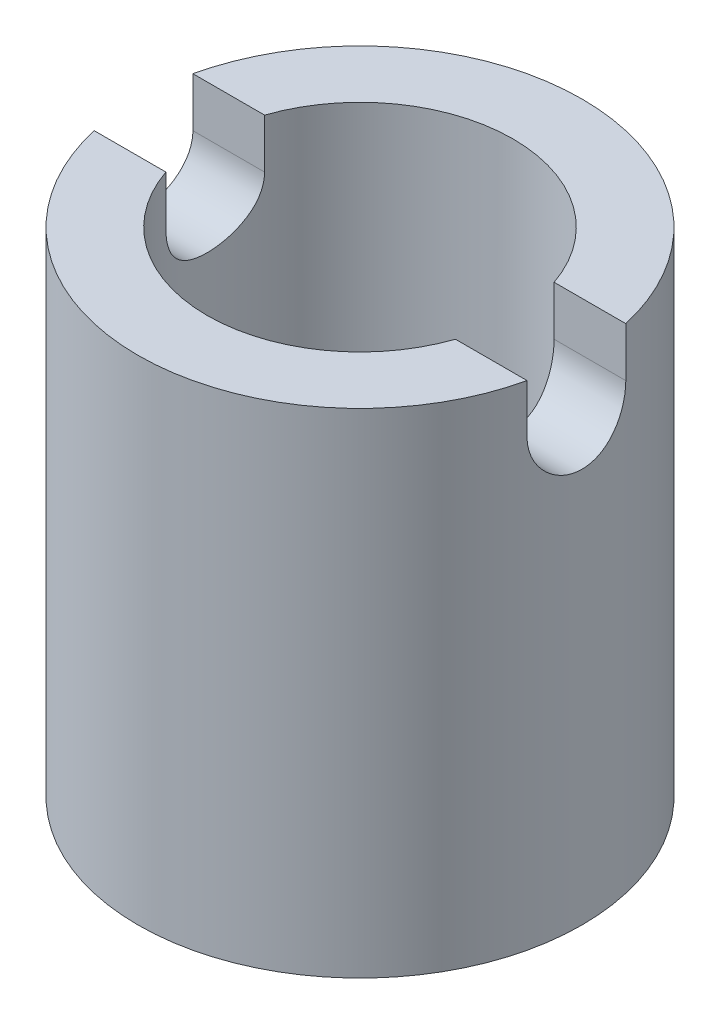
ISO-10303-21;
HEADER;
FILE_DESCRIPTION(('STEP AP214'),'2;1');
FILE_NAME('part.step','',(''),(''),'','','');
FILE_SCHEMA(('AUTOMOTIVE_DESIGN { 1 0 10303 214 1 1 1 1 }'));
ENDSEC;
DATA;
#1=APPLICATION_CONTEXT('core data for automotive mechanical design processes');
#2=APPLICATION_PROTOCOL_DEFINITION('international standard','automotive_design',2000,#1);
#3=PRODUCT_CONTEXT('',#1,'mechanical');
#4=PRODUCT('Part','Part','',(#3));
#5=PRODUCT_RELATED_PRODUCT_CATEGORY('part','',(#4));
#6=PRODUCT_DEFINITION_FORMATION('','',#4);
#7=PRODUCT_DEFINITION_CONTEXT('part definition',#1,'design');
#8=PRODUCT_DEFINITION('design','',#6,#7);
#9=PRODUCT_DEFINITION_SHAPE('','',#8);
#10=(LENGTH_UNIT() NAMED_UNIT(*) SI_UNIT(.MILLI.,.METRE.));
#11=(NAMED_UNIT(*) PLANE_ANGLE_UNIT() SI_UNIT($,.RADIAN.));
#12=(NAMED_UNIT(*) SI_UNIT($,.STERADIAN.) SOLID_ANGLE_UNIT());
#13=UNCERTAINTY_MEASURE_WITH_UNIT(LENGTH_MEASURE(1.E-05),#10,'distance_accuracy_value','');
#14=(GEOMETRIC_REPRESENTATION_CONTEXT(3) GLOBAL_UNCERTAINTY_ASSIGNED_CONTEXT((#13)) GLOBAL_UNIT_ASSIGNED_CONTEXT((#10,
#11,#12)) REPRESENTATION_CONTEXT('',''));
#15=CARTESIAN_POINT('',(0.,0.,0.));
#16=DIRECTION('',(0.,0.,1.));
#17=DIRECTION('',(1.,0.,0.));
#18=AXIS2_PLACEMENT_3D('',#15,#16,#17);
#19=CARTESIAN_POINT('',(0.,0.,0.));
#20=DIRECTION('',(0.,1.,0.));
#21=DIRECTION('',(0.,0.,1.));
#22=AXIS2_PLACEMENT_3D('',#19,#20,#21);
#23=PLANE('',#22);
#24=CARTESIAN_POINT('',(0.,0.,0.));
#25=DIRECTION('',(0.,1.,0.));
#26=DIRECTION('',(0.,0.,1.));
#27=AXIS2_PLACEMENT_3D('',#24,#25,#26);
#28=CIRCLE('',#27,4.5);
#29=CARTESIAN_POINT('',(0.,0.,4.5));
#30=VERTEX_POINT('',#29);
#31=EDGE_CURVE('E217',#30,#30,#28,.T.);
#32=ORIENTED_EDGE('',*,*,#31,.F.);
#33=EDGE_LOOP('',(#32));
#34=FACE_BOUND('',#33,.T.);
#35=CARTESIAN_POINT('',(0.,0.,0.));
#36=DIRECTION('',(0.,1.,0.));
#37=DIRECTION('',(0.,0.,1.));
#38=AXIS2_PLACEMENT_3D('',#35,#36,#37);
#39=CIRCLE('',#38,3.1);
#40=CARTESIAN_POINT('',(0.,0.,3.1));
#41=VERTEX_POINT('',#40);
#42=EDGE_CURVE('E50',#41,#41,#39,.T.);
#43=ORIENTED_EDGE('',*,*,#42,.T.);
#44=EDGE_LOOP('',(#43));
#45=FACE_BOUND('',#44,.T.);
#46=ADVANCED_FACE('F45',(#34,#45),#23,.F.);
#47=CARTESIAN_POINT('',(0.,9.,0.));
#48=DIRECTION('',(0.,-1.,0.));
#49=DIRECTION('',(0.,0.,-1.));
#50=AXIS2_PLACEMENT_3D('',#47,#48,#49);
#51=CYLINDRICAL_SURFACE('',#50,4.5);
#52=CARTESIAN_POINT('',(-4.38748219369606,9.,0.999999999999999));
#53=CARTESIAN_POINT('',(-4.38748057820017,8.9722374267632,1.00000022729756));
#54=CARTESIAN_POINT('',(-4.38774603792456,8.94448850762744,0.998843124720514));
#55=CARTESIAN_POINT('',(-4.38879432652499,8.88919622910976,0.99422968705631));
#56=CARTESIAN_POINT('',(-4.38957708187657,8.86165284107774,0.990773678717656));
#57=CARTESIAN_POINT('',(-4.39267087860999,8.77972846796468,0.977003810088015));
#58=CARTESIAN_POINT('',(-4.39572762287051,8.72590731765073,0.963287918104315));
#59=CARTESIAN_POINT('',(-4.40347693098967,8.62140532903998,0.927214454041531));
#60=CARTESIAN_POINT('',(-4.40816953687928,8.57072457147022,0.904856659920317));
#61=CARTESIAN_POINT('',(-4.41865929364095,8.47381365335537,0.852155803282729));
#62=CARTESIAN_POINT('',(-4.42445663511658,8.42758426289377,0.821811362459797));
#63=CARTESIAN_POINT('',(-4.43661426749371,8.34010972441778,0.753441836232103));
#64=CARTESIAN_POINT('',(-4.44298190226389,8.29895312248351,0.715304798206197));
#65=CARTESIAN_POINT('',(-4.45549904324729,8.22356146692631,0.632670298583491));
#66=CARTESIAN_POINT('',(-4.46164851515654,8.18932749787694,0.588171842200235));
#67=CARTESIAN_POINT('',(-4.47311661459631,8.12840376829879,0.493480718999463));
#68=CARTESIAN_POINT('',(-4.47842549507079,8.10179996527322,0.443231466972285));
#69=CARTESIAN_POINT('',(-4.48753032196369,8.05744917950465,0.338840325996899));
#70=CARTESIAN_POINT('',(-4.49132652279754,8.03970070726941,0.284699093445024));
#71=CARTESIAN_POINT('',(-4.49692639035223,8.01384342708513,0.174986021353865));
#72=CARTESIAN_POINT('',(-4.49876123301171,8.00558363249991,0.119451384668944));
#73=CARTESIAN_POINT('',(-4.50033975027167,7.99846584026957,0.0077551127497743));
#74=CARTESIAN_POINT('',(-4.50008362385938,7.99960694798699,-0.0484064623138756));
#75=CARTESIAN_POINT('',(-4.49753274170445,8.01114688291884,-0.158718181022163));
#76=CARTESIAN_POINT('',(-4.49527387966133,8.02138271828657,-0.212886328087552));
#77=CARTESIAN_POINT('',(-4.48901235449708,8.05056148976137,-0.318715838159107));
#78=CARTESIAN_POINT('',(-4.48500962486109,8.06950475799012,-0.370377105463959));
#79=CARTESIAN_POINT('',(-4.4756526258873,8.11570380281411,-0.470177597220577));
#80=CARTESIAN_POINT('',(-4.47028840892171,8.14302108290712,-0.518287379800329));
#81=CARTESIAN_POINT('',(-4.45879618403283,8.2051460967624,-0.609297798291436));
#82=CARTESIAN_POINT('',(-4.4526680906951,8.23995466849596,-0.6521978506051));
#83=CARTESIAN_POINT('',(-4.44016659933762,8.31695512505233,-0.732537514994334));
#84=CARTESIAN_POINT('',(-4.43379075752742,8.35928882796946,-0.76984092892418));
#85=CARTESIAN_POINT('',(-4.42163303741232,8.44969035552322,-0.836854255104537));
#86=CARTESIAN_POINT('',(-4.41585132197676,8.49775974473452,-0.866562088463181));
#87=CARTESIAN_POINT('',(-4.40552868647316,8.59850064694763,-0.917605722038659));
#88=CARTESIAN_POINT('',(-4.40099241682023,8.65118846461715,-0.938910270762524));
#89=CARTESIAN_POINT('',(-4.39373905796516,8.75948840213228,-0.972293085974256));
#90=CARTESIAN_POINT('',(-4.39101925996542,8.81509603364802,-0.984385094390383));
#91=CARTESIAN_POINT('',(-4.38874305217374,8.89263686833711,-0.994454316918766));
#92=CARTESIAN_POINT('',(-4.38827083327373,8.91407243613606,-0.996534530294845));
#93=CARTESIAN_POINT('',(-4.38764061776731,8.95700204078175,-0.999305697460969));
#94=CARTESIAN_POINT('',(-4.38748210050975,8.97849592135961,-0.999998953207969));
#95=CARTESIAN_POINT('',(-4.38748219369606,9.,-0.999999999999999));
#96=B_SPLINE_CURVE_WITH_KNOTS('',3,(#52,#53,#54,#55,#56,#57,#58,#59,#60,#61,#62,#63,#64,#65,#66,
#67,#68,#69,#70,#71,#72,#73,#74,#75,#76,#77,#78,#79,#80,#81,#82,#83,#84,#85,#86,#87,#88,#89,#90,
#91,#92,#93,#94,#95),.UNSPECIFIED.,.F.,.F.,(4,2,2,2,2,2,2,2,2,2,2,2,2,2,2,2,2,2,2,2,2,4),(0.,
0.0832354312787236,0.1664590346507,0.332474058250128,0.498493347667373,0.664541306899725,
0.833167762015411,1.00182061551778,1.17230483262337,1.34276036411496,1.51046425594233,
1.67815218840285,1.8428941784505,2.00764245266122,2.17363096141649,2.33963804720395,
2.50919081696053,2.67878994333886,2.8490139860664,3.01898361347143,3.08357107270779,
3.14805124582346),.UNSPECIFIED.);
#97=CARTESIAN_POINT('',(-4.38748219369606,9.,0.999999999999999));
#98=VERTEX_POINT('',#97);
#99=CARTESIAN_POINT('',(-4.38748219369606,9.,-1.));
#100=VERTEX_POINT('',#99);
#101=EDGE_CURVE('E177',#98,#100,#96,.T.);
#102=ORIENTED_EDGE('',*,*,#101,.T.);
#103=DIRECTION('',(0.,-1.,0.));
#104=VECTOR('',#103,1.);
#105=CARTESIAN_POINT('',(-4.38748219369606,10.,-1.));
#106=LINE('',#105,#104);
#107=CARTESIAN_POINT('',(-4.38748219369606,10.,-1.));
#108=VERTEX_POINT('',#107);
#109=EDGE_CURVE('E158',#108,#100,#106,.T.);
#110=ORIENTED_EDGE('',*,*,#109,.F.);
#111=CARTESIAN_POINT('',(0.,10.,0.));
#112=DIRECTION('',(0.,1.,0.));
#113=DIRECTION('',(0.,0.,1.));
#114=AXIS2_PLACEMENT_3D('',#111,#112,#113);
#115=CIRCLE('',#114,4.5);
#116=CARTESIAN_POINT('',(4.38748219369606,10.,-0.999999999999999));
#117=VERTEX_POINT('',#116);
#118=EDGE_CURVE('E108',#117,#108,#115,.T.);
#119=ORIENTED_EDGE('',*,*,#118,.F.);
#120=DIRECTION('',(0.,-1.,0.));
#121=VECTOR('',#120,1.);
#122=CARTESIAN_POINT('',(4.38748219369606,10.,-0.999999999999999));
#123=LINE('',#122,#121);
#124=CARTESIAN_POINT('',(4.38748219369606,9.,-0.999999999999999));
#125=VERTEX_POINT('',#124);
#126=EDGE_CURVE('E154',#117,#125,#123,.T.);
#127=ORIENTED_EDGE('',*,*,#126,.T.);
#128=CARTESIAN_POINT('',(4.38748219369606,9.,-0.999999999999999));
#129=CARTESIAN_POINT('',(4.38748057820017,8.9722374267632,-1.00000022729756));
#130=CARTESIAN_POINT('',(4.38774603792456,8.94448850762744,-0.998843124720514));
#131=CARTESIAN_POINT('',(4.38879432652499,8.88919622910976,-0.99422968705631));
#132=CARTESIAN_POINT('',(4.38957708187657,8.86165284107774,-0.990773678717656));
#133=CARTESIAN_POINT('',(4.39267087860999,8.77972846796468,-0.977003810088015));
#134=CARTESIAN_POINT('',(4.39572762287051,8.72590731765073,-0.963287918104315));
#135=CARTESIAN_POINT('',(4.40347693098967,8.62140532903998,-0.927214454041531));
#136=CARTESIAN_POINT('',(4.40816953687928,8.57072457147022,-0.904856659920317));
#137=CARTESIAN_POINT('',(4.41865929364095,8.47381365335537,-0.852155803282729));
#138=CARTESIAN_POINT('',(4.42445663511658,8.42758426289377,-0.821811362459797));
#139=CARTESIAN_POINT('',(4.43661426749371,8.34010972441778,-0.753441836232103));
#140=CARTESIAN_POINT('',(4.44298190226389,8.29895312248351,-0.715304798206197));
#141=CARTESIAN_POINT('',(4.45549904324729,8.22356146692631,-0.632670298583491));
#142=CARTESIAN_POINT('',(4.46164851515654,8.18932749787694,-0.588171842200235));
#143=CARTESIAN_POINT('',(4.47311661459631,8.12840376829879,-0.493480718999463));
#144=CARTESIAN_POINT('',(4.47842549507079,8.10179996527322,-0.443231466972285));
#145=CARTESIAN_POINT('',(4.48753032196369,8.05744917950465,-0.338840325996899));
#146=CARTESIAN_POINT('',(4.49132652279754,8.03970070726941,-0.284699093445024));
#147=CARTESIAN_POINT('',(4.49692639035223,8.01384342708513,-0.174986021353865));
#148=CARTESIAN_POINT('',(4.49876123301171,8.00558363249991,-0.119451384668944));
#149=CARTESIAN_POINT('',(4.50033975027167,7.99846584026957,-0.0077551127497743));
#150=CARTESIAN_POINT('',(4.50008362385938,7.99960694798699,0.0484064623138756));
#151=CARTESIAN_POINT('',(4.49753274170445,8.01114688291884,0.158718181022163));
#152=CARTESIAN_POINT('',(4.49527387966133,8.02138271828657,0.212886328087552));
#153=CARTESIAN_POINT('',(4.48901235449708,8.05056148976137,0.318715838159107));
#154=CARTESIAN_POINT('',(4.48500962486109,8.06950475799012,0.370377105463959));
#155=CARTESIAN_POINT('',(4.4756526258873,8.11570380281411,0.470177597220577));
#156=CARTESIAN_POINT('',(4.47028840892171,8.14302108290712,0.518287379800329));
#157=CARTESIAN_POINT('',(4.45879618403283,8.2051460967624,0.609297798291436));
#158=CARTESIAN_POINT('',(4.4526680906951,8.23995466849596,0.6521978506051));
#159=CARTESIAN_POINT('',(4.44016659933762,8.31695512505233,0.732537514994334));
#160=CARTESIAN_POINT('',(4.43379075752742,8.35928882796946,0.76984092892418));
#161=CARTESIAN_POINT('',(4.42163303741232,8.44969035552322,0.836854255104537));
#162=CARTESIAN_POINT('',(4.41585132197676,8.49775974473452,0.866562088463181));
#163=CARTESIAN_POINT('',(4.40552868647316,8.59850064694763,0.917605722038659));
#164=CARTESIAN_POINT('',(4.40099241682023,8.65118846461715,0.938910270762524));
#165=CARTESIAN_POINT('',(4.39373905796516,8.75948840213228,0.972293085974256));
#166=CARTESIAN_POINT('',(4.39101925996542,8.81509603364802,0.984385094390383));
#167=CARTESIAN_POINT('',(4.38874305217374,8.89263686833711,0.994454316918766));
#168=CARTESIAN_POINT('',(4.38827083327373,8.91407243613606,0.996534530294845));
#169=CARTESIAN_POINT('',(4.38764061776731,8.95700204078175,0.999305697460969));
#170=CARTESIAN_POINT('',(4.38748210050975,8.97849592135961,0.999998953207969));
#171=CARTESIAN_POINT('',(4.38748219369606,9.,0.999999999999999));
#172=B_SPLINE_CURVE_WITH_KNOTS('',3,(#128,#129,#130,#131,#132,#133,#134,#135,#136,#137,#138,
#139,#140,#141,#142,#143,#144,#145,#146,#147,#148,#149,#150,#151,#152,#153,#154,#155,#156,#157,
#158,#159,#160,#161,#162,#163,#164,#165,#166,#167,#168,#169,#170,#171),.UNSPECIFIED.,.F.,.F.,(4,
2,2,2,2,2,2,2,2,2,2,2,2,2,2,2,2,2,2,2,2,4),(0.,0.0832354312787236,0.1664590346507,
0.332474058250128,0.498493347667373,0.664541306899725,0.833167762015411,1.00182061551778,
1.17230483262337,1.34276036411496,1.51046425594233,1.67815218840285,1.8428941784505,
2.00764245266122,2.17363096141649,2.33963804720395,2.50919081696053,2.67878994333886,
2.8490139860664,3.01898361347143,3.08357107270779,3.14805124582346),.UNSPECIFIED.);
#173=CARTESIAN_POINT('',(4.38748219369606,9.,0.999999999999999));
#174=VERTEX_POINT('',#173);
#175=EDGE_CURVE('E186',#125,#174,#172,.T.);
#176=ORIENTED_EDGE('',*,*,#175,.T.);
#177=DIRECTION('',(0.,-1.,0.));
#178=VECTOR('',#177,1.);
#179=CARTESIAN_POINT('',(4.38748219369606,10.,0.999999999999997));
#180=LINE('',#179,#178);
#181=CARTESIAN_POINT('',(4.38748219369606,10.,0.999999999999997));
#182=VERTEX_POINT('',#181);
#183=EDGE_CURVE('E73',#182,#174,#180,.T.);
#184=ORIENTED_EDGE('',*,*,#183,.F.);
#185=CARTESIAN_POINT('',(0.,10.,0.));
#186=DIRECTION('',(0.,1.,0.));
#187=DIRECTION('',(0.,0.,1.));
#188=AXIS2_PLACEMENT_3D('',#185,#186,#187);
#189=CIRCLE('',#188,4.5);
#190=CARTESIAN_POINT('',(-4.38748219369606,10.,0.999999999999999));
#191=VERTEX_POINT('',#190);
#192=EDGE_CURVE('E125',#191,#182,#189,.T.);
#193=ORIENTED_EDGE('',*,*,#192,.F.);
#194=DIRECTION('',(0.,-1.,0.));
#195=VECTOR('',#194,1.);
#196=CARTESIAN_POINT('',(-4.38748219369606,10.,0.999999999999999));
#197=LINE('',#196,#195);
#198=EDGE_CURVE('E133',#191,#98,#197,.T.);
#199=ORIENTED_EDGE('',*,*,#198,.T.);
#200=EDGE_LOOP('',(#102,#110,#119,#127,#176,#184,#193,#199));
#201=FACE_BOUND('',#200,.T.);
#202=ORIENTED_EDGE('',*,*,#31,.T.);
#203=EDGE_LOOP('',(#202));
#204=FACE_BOUND('',#203,.T.);
#205=ADVANCED_FACE('F143',(#201,#204),#51,.T.);
#206=CARTESIAN_POINT('',(0.,9.,0.));
#207=DIRECTION('',(0.,-1.,0.));
#208=DIRECTION('',(0.,0.,-1.));
#209=AXIS2_PLACEMENT_3D('',#206,#207,#208);
#210=CYLINDRICAL_SURFACE('',#209,3.1);
#211=CARTESIAN_POINT('',(2.9497377124221,9.30158344133119,-0.953439787251839));
#212=CARTESIAN_POINT('',(2.94703752781496,9.27519023333855,-0.961788138474641));
#213=CARTESIAN_POINT('',(2.94465468140349,9.24843242445668,-0.969045415820296));
#214=CARTESIAN_POINT('',(2.9405861814822,9.19435421597892,-0.981323777765068));
#215=CARTESIAN_POINT('',(2.93890059757875,9.16703376050075,-0.98634463911092));
#216=CARTESIAN_POINT('',(2.93499190357734,9.0846476209573,-0.997946634303038));
#217=CARTESIAN_POINT('',(2.93390030903565,9.02900054147089,-1.00111669290742));
#218=CARTESIAN_POINT('',(2.93488321788616,8.91978771576878,-0.998228230765328));
#219=CARTESIAN_POINT('',(2.93685797105113,8.86621213693715,-0.992460475057205));
#220=CARTESIAN_POINT('',(2.94354008085028,8.76085187811807,-0.972461597617109));
#221=CARTESIAN_POINT('',(2.94824695202879,8.70906688170304,-0.958231979417959));
#222=CARTESIAN_POINT('',(2.95985516819929,8.60853242713759,-0.92174922357835));
#223=CARTESIAN_POINT('',(2.9667620206408,8.55979095843396,-0.89947593041609));
#224=CARTESIAN_POINT('',(2.98200701398694,8.46663160262721,-0.847563557445424));
#225=CARTESIAN_POINT('',(2.99034585022325,8.4222158324605,-0.817920896130569));
#226=CARTESIAN_POINT('',(3.00800791961678,8.33671526781422,-0.750439538665921));
#227=CARTESIAN_POINT('',(3.01735918450198,8.29589242010687,-0.712275922635291));
#228=CARTESIAN_POINT('',(3.03567824117257,8.22111665712873,-0.629639843380895));
#229=CARTESIAN_POINT('',(3.04464599518468,8.18716441734387,-0.585166760570447));
#230=CARTESIAN_POINT('',(3.06141695756754,8.12641770989493,-0.490005821795799));
#231=CARTESIAN_POINT('',(3.06919177924709,8.09978839723399,-0.439207134654506));
#232=CARTESIAN_POINT('',(3.08246134487759,8.05553381094299,-0.333556637148275));
#233=CARTESIAN_POINT('',(3.08795705085785,8.03790473752677,-0.278706548447723));
#234=CARTESIAN_POINT('',(3.09570164645804,8.01334283656311,-0.17116645718513));
#235=CARTESIAN_POINT('',(3.09817854029893,8.00565571924618,-0.118664425832634));
#236=CARTESIAN_POINT('',(3.10042220781517,7.99868618520239,-0.0130502882226227));
#237=CARTESIAN_POINT('',(3.10018934819763,7.99940263123324,0.0400617345137853));
#238=CARTESIAN_POINT('',(3.09696620368164,8.0094326294291,0.14773687922767));
#239=CARTESIAN_POINT('',(3.09385553541942,8.01912153145491,0.202261602927251));
#240=CARTESIAN_POINT('',(3.0850470343443,8.0472712268917,0.308779526603644));
#241=CARTESIAN_POINT('',(3.07934852690538,8.06573430770926,0.360772062546436));
#242=CARTESIAN_POINT('',(3.06598781379693,8.11076391027303,0.460715160957651));
#243=CARTESIAN_POINT('',(3.05832931013582,8.13731517299179,0.50867311941842));
#244=CARTESIAN_POINT('',(3.04183248384003,8.19776023065146,0.59949026618263));
#245=CARTESIAN_POINT('',(3.03299387543456,8.23165580531205,0.642348214713038));
#246=CARTESIAN_POINT('',(3.01475309004741,8.30709661548832,0.723213362694789));
#247=CARTESIAN_POINT('',(3.00534193094895,8.34884903669282,0.76102543725985));
#248=CARTESIAN_POINT('',(2.98725769446386,8.4381999058337,0.829178867962244));
#249=CARTESIAN_POINT('',(2.97858454571045,8.48579778741461,0.85952094699858));
#250=CARTESIAN_POINT('',(2.96290033232434,8.58617059035021,0.912132968967825));
#251=CARTESIAN_POINT('',(2.95590720275891,8.63899354702354,0.934317043842223));
#252=CARTESIAN_POINT('',(2.9445925185952,8.7479020860119,0.969390663669745));
#253=CARTESIAN_POINT('',(2.94027004771436,8.80398654209771,0.982283396664044));
#254=CARTESIAN_POINT('',(2.93500676264388,8.91514907317271,0.997899000644755));
#255=CARTESIAN_POINT('',(2.93392203622863,8.97015820001606,1.00105488485793));
#256=CARTESIAN_POINT('',(2.93461952908474,9.05248890588961,0.999002040027038));
#257=CARTESIAN_POINT('',(2.93524234719843,9.07994609431324,0.997178200018502));
#258=CARTESIAN_POINT('',(2.93723815324096,9.13459346709996,0.991281700631008));
#259=CARTESIAN_POINT('',(2.93861121763655,9.16178362395898,0.987208812023602));
#260=CARTESIAN_POINT('',(2.94034460323476,9.1887495318451,0.982025261502093));
#261=B_SPLINE_CURVE_WITH_KNOTS('',3,(#211,#212,#213,#214,#215,#216,#217,#218,#219,#220,#221,
#222,#223,#224,#225,#226,#227,#228,#229,#230,#231,#232,#233,#234,#235,#236,#237,#238,#239,#240,
#241,#242,#243,#244,#245,#246,#247,#248,#249,#250,#251,#252,#253,#254,#255,#256,#257,#258,#259,
#260),.UNSPECIFIED.,.F.,.F.,(4,2,2,2,2,2,2,2,2,2,2,2,2,2,2,2,2,2,2,2,2,2,2,2,4),(0.,
0.0833889488953054,0.166786220341133,0.33309220652036,0.494100415437364,0.655080024406702,
0.816465840830983,0.977930244476143,1.14713911323492,1.31636460974143,1.48914125596565,
1.66184489764782,1.82048108556174,1.97909580571367,2.14466103004371,2.31026944051322,
2.47556733184059,2.64090532407622,2.81144709380981,2.98197235309459,3.15424433607938,
3.32645718099685,3.49089220485541,3.57337610519217,3.65586841403883),.UNSPECIFIED.);
#262=CARTESIAN_POINT('',(2.93428015022424,9.,-0.999999999999999));
#263=VERTEX_POINT('',#262);
#264=CARTESIAN_POINT('',(2.93428015022424,9.,0.999999999999999));
#265=VERTEX_POINT('',#264);
#266=EDGE_CURVE('E12',#263,#265,#261,.T.);
#267=ORIENTED_EDGE('',*,*,#266,.F.);
#268=DIRECTION('',(0.,-1.,0.));
#269=VECTOR('',#268,1.);
#270=CARTESIAN_POINT('',(2.93428015022424,10.,-0.999999999999999));
#271=LINE('',#270,#269);
#272=CARTESIAN_POINT('',(2.93428015022424,10.,-0.999999999999999));
#273=VERTEX_POINT('',#272);
#274=EDGE_CURVE('E64',#273,#263,#271,.T.);
#275=ORIENTED_EDGE('',*,*,#274,.F.);
#276=CARTESIAN_POINT('',(0.,10.,0.));
#277=DIRECTION('',(0.,1.,0.));
#278=DIRECTION('',(0.,0.,1.));
#279=AXIS2_PLACEMENT_3D('',#276,#277,#278);
#280=CIRCLE('',#279,3.1);
#281=CARTESIAN_POINT('',(-2.93428015022424,10.,-0.999999999999999));
#282=VERTEX_POINT('',#281);
#283=EDGE_CURVE('E169',#282,#273,#280,.F.);
#284=ORIENTED_EDGE('',*,*,#283,.F.);
#285=DIRECTION('',(0.,-1.,0.));
#286=VECTOR('',#285,1.);
#287=CARTESIAN_POINT('',(-2.93428015022424,9.,-0.999999999999999));
#288=LINE('',#287,#286);
#289=CARTESIAN_POINT('',(-2.93428015022424,9.,-0.999999999999999));
#290=VERTEX_POINT('',#289);
#291=EDGE_CURVE('E161',#282,#290,#288,.T.);
#292=ORIENTED_EDGE('',*,*,#291,.T.);
#293=CARTESIAN_POINT('',(-3.0986123284779,8.00431010741612,-0.092745015008774));
#294=CARTESIAN_POINT('',(-3.09696616350948,8.00943253530216,-0.147733870259167));
#295=CARTESIAN_POINT('',(-3.09385573454783,8.01912085409528,-0.202257395909112));
#296=CARTESIAN_POINT('',(-3.08504747075715,8.04726987348274,-0.308776050271984));
#297=CARTESIAN_POINT('',(-3.07934877535932,8.06573349185808,-0.360770331669582));
#298=CARTESIAN_POINT('',(-3.06598750160718,8.11076494097308,-0.460717368840141));
#299=CARTESIAN_POINT('',(-3.05832860654814,8.13731758970976,-0.508677482823546));
#300=CARTESIAN_POINT('',(-3.04183167943671,8.19776333894246,-0.599494203465956));
#301=CARTESIAN_POINT('',(-3.03299346893988,8.23165755078901,-0.642350035925504));
#302=CARTESIAN_POINT('',(-3.01475395943955,8.30709295352556,-0.723209488761425));
#303=CARTESIAN_POINT('',(-3.00534369339512,8.34884097057315,-0.761018318670541));
#304=CARTESIAN_POINT('',(-2.98725934901065,8.43819108955936,-0.829173109069884));
#305=CARTESIAN_POINT('',(-2.97858533809344,8.48579372666156,-0.859518386564349));
#306=CARTESIAN_POINT('',(-2.96290008919206,8.58617112583913,-0.9121336859715));
#307=CARTESIAN_POINT('',(-2.95590666199981,8.63899357236037,-0.934318428606523));
#308=CARTESIAN_POINT('',(-2.94459252786334,8.74790718476096,-0.969390929647438));
#309=CARTESIAN_POINT('',(-2.94027077925416,8.80399706734909,-0.982282311782344));
#310=CARTESIAN_POINT('',(-2.93500279612792,8.91520801346056,-0.99790973106394));
#311=CARTESIAN_POINT('',(-2.9339165539975,8.97026331101665,-1.00106719962485));
#312=CARTESIAN_POINT('',(-2.93485995523055,9.08011243341787,-0.998298270882565));
#313=CARTESIAN_POINT('',(-2.93688913719034,9.13490629577678,-0.992373218728254));
#314=CARTESIAN_POINT('',(-2.94369964572381,9.2410279633028,-0.971978039008097));
#315=CARTESIAN_POINT('',(-2.94839927495852,9.29241022020163,-0.957761254783081));
#316=CARTESIAN_POINT('',(-2.95994224976124,9.39206006467212,-0.921467424646058));
#317=CARTESIAN_POINT('',(-2.9667859798099,9.44032709174643,-0.899388968880218));
#318=CARTESIAN_POINT('',(-2.98212227494725,9.53410186754767,-0.847176563008173));
#319=CARTESIAN_POINT('',(-2.99066112731482,9.57946930595551,-0.816804520993286));
#320=CARTESIAN_POINT('',(-3.00831727045731,9.664613415868,-0.749164246916491));
#321=CARTESIAN_POINT('',(-3.01743471912525,9.70438855168578,-0.71189412707554));
#322=CARTESIAN_POINT('',(-3.03569785536352,9.77899154328588,-0.629593458073228));
#323=CARTESIAN_POINT('',(-3.04482765295042,9.81353040379694,-0.584296649519022));
#324=CARTESIAN_POINT('',(-3.0616864921599,9.8745202482257,-0.488309986832321));
#325=CARTESIAN_POINT('',(-3.06941562376374,9.90097175176464,-0.437620479468637));
#326=CARTESIAN_POINT('',(-3.08253996534674,9.94471445609209,-0.332731880040581));
#327=CARTESIAN_POINT('',(-3.08795738728718,9.96209321149677,-0.278572219074136));
#328=CARTESIAN_POINT('',(-3.09594643918333,9.98743661207255,-0.167895549812949));
#329=CARTESIAN_POINT('',(-3.098519016775,9.99540439216037,-0.111379333015715));
#330=CARTESIAN_POINT('',(-3.10047588455036,10.0014776540951,-0.000282306844339808));
#331=CARTESIAN_POINT('',(-3.09999622829688,10.0000039694134,0.0542734725849836));
#332=CARTESIAN_POINT('',(-3.09621933446289,9.98823326495065,0.162319925130663));
#333=CARTESIAN_POINT('',(-3.09292225971688,9.97793675509035,0.215810659619145));
#334=CARTESIAN_POINT('',(-3.08391587856145,9.94906336301973,0.319605918284951));
#335=CARTESIAN_POINT('',(-3.07823509499025,9.93058425168524,0.36994028075145));
#336=CARTESIAN_POINT('',(-3.0650396974317,9.88595784095713,0.46682421789941));
#337=CARTESIAN_POINT('',(-3.05752473726445,9.8598090938191,0.513373075896414));
#338=CARTESIAN_POINT('',(-3.04109846098798,9.79946963447851,0.603227990924139));
#339=CARTESIAN_POINT('',(-3.03214587615384,9.76501795505356,0.646351200416936));
#340=CARTESIAN_POINT('',(-3.01398649443032,9.68953236773396,0.726340811369141));
#341=CARTESIAN_POINT('',(-3.00477962877243,9.64849666451522,0.763205500603346));
#342=CARTESIAN_POINT('',(-2.98678189552955,9.55931599079963,0.830906186333887));
#343=CARTESIAN_POINT('',(-2.97801611217036,9.51097551733798,0.861492160839492));
#344=CARTESIAN_POINT('',(-2.9623015297154,9.40955350812088,0.914071500068848));
#345=CARTESIAN_POINT('',(-2.95535238551858,9.35647287541222,0.93606649718552));
#346=CARTESIAN_POINT('',(-2.94428170333408,9.24824518529907,0.970322142695102));
#347=CARTESIAN_POINT('',(-2.9401021900452,9.19316777172613,0.982783281790967));
#348=CARTESIAN_POINT('',(-2.93488519050517,9.08156250569758,0.99825767598231));
#349=CARTESIAN_POINT('',(-2.93384658877728,9.02503517536597,1.00127428526187));
#350=CARTESIAN_POINT('',(-2.93501961186765,8.91498863910451,0.997827954497218));
#351=CARTESIAN_POINT('',(-2.93708017664116,8.86145335637235,0.991805621285844));
#352=CARTESIAN_POINT('',(-2.94392152908154,8.75621033573854,0.971308982538229));
#353=CARTESIAN_POINT('',(-2.94870247547124,8.70450270465967,0.956834183834842));
#354=CARTESIAN_POINT('',(-2.96044249631023,8.60412594136552,0.919866561357455));
#355=CARTESIAN_POINT('',(-2.9674084456044,8.5554669893608,0.897348398652765));
#356=CARTESIAN_POINT('',(-2.98274665440381,8.46252195402855,0.844964513977241));
#357=CARTESIAN_POINT('',(-2.99111927063685,8.41823698446882,0.815096927312805));
#358=CARTESIAN_POINT('',(-3.00882540898792,8.33302756458538,0.74716627171207));
#359=CARTESIAN_POINT('',(-3.01818579560535,8.2923679973716,0.708777555142584));
#360=CARTESIAN_POINT('',(-3.03649382447949,8.21795240518395,0.625709124134889));
#361=CARTESIAN_POINT('',(-3.04544138419828,8.18419775614207,0.581028158839517));
#362=CARTESIAN_POINT('',(-3.06213428337426,8.12391544109418,0.485517791608194));
#363=CARTESIAN_POINT('',(-3.06985183312189,8.09754673060221,0.434582829292574));
#364=CARTESIAN_POINT('',(-3.08298370254007,8.05383618516212,0.328709303091031));
#365=CARTESIAN_POINT('',(-3.08839918229762,8.03648980258551,0.27377277211274));
#366=CARTESIAN_POINT('',(-3.0959196316739,8.01266403179604,0.16694191782595));
#367=CARTESIAN_POINT('',(-3.09829266153568,8.00530074425019,0.115262367966105));
#368=CARTESIAN_POINT('',(-3.1004146986056,7.99871004322298,0.0113356718313279));
#369=CARTESIAN_POINT('',(-3.10016403704855,7.99948160273656,-0.0409114019630944));
#370=CARTESIAN_POINT('',(-3.0986123284779,8.00431010741612,-0.092745015008774));
#371=B_SPLINE_CURVE_WITH_KNOTS('',3,(#293,#294,#295,#296,#297,#298,#299,#300,#301,#302,#303,
#304,#305,#306,#307,#308,#309,#310,#311,#312,#313,#314,#315,#316,#317,#318,#319,#320,#321,#322,
#323,#324,#325,#326,#327,#328,#329,#330,#331,#332,#333,#334,#335,#336,#337,#338,#339,#340,#341,
#342,#343,#344,#345,#346,#347,#348,#349,#350,#351,#352,#353,#354,#355,#356,#357,#358,#359,#360,
#361,#362,#363,#364,#365,#366,#367,#368,#369,#370),.UNSPECIFIED.,.T.,.F.,(4,2,2,2,2,2,2,2,2,2,2,
2,2,2,2,2,2,2,2,2,2,2,2,2,2,2,2,2,2,2,2,2,2,2,2,2,2,2,4),(0.,0.165559274240392,
0.331173635376716,0.496479056301203,0.661809518326032,0.832335232789919,1.00287654639964,
1.17515256631946,1.34736137483845,1.51200151025334,1.6766172643203,1.83644891717507,
1.99630924749991,2.16135559211736,2.32644717150499,2.49869122991215,2.67092421912953,
2.8414628659304,3.01194468808194,3.17488216486027,3.33781022519996,3.49884195070518,
3.65990409264594,3.82690476689972,3.99395105634063,4.16672443503201,4.33946496863593,
4.50846465464324,4.6774043143278,4.83837199486732,4.99934906815791,5.16083780453519,
5.3223675561091,5.49168349625496,5.66103314292143,5.83378782106715,6.00645533908164,
6.16253458168857,6.31859411989906),.UNSPECIFIED.);
#372=CARTESIAN_POINT('',(-2.93428015022424,9.,0.999999999999999));
#373=VERTEX_POINT('',#372);
#374=EDGE_CURVE('E56',#373,#290,#371,.T.);
#375=ORIENTED_EDGE('',*,*,#374,.F.);
#376=DIRECTION('',(0.,-1.,0.));
#377=VECTOR('',#376,1.);
#378=CARTESIAN_POINT('',(-2.93428015022424,9.,0.999999999999999));
#379=LINE('',#378,#377);
#380=CARTESIAN_POINT('',(-2.93428015022424,10.,0.999999999999999));
#381=VERTEX_POINT('',#380);
#382=EDGE_CURVE('E141',#381,#373,#379,.T.);
#383=ORIENTED_EDGE('',*,*,#382,.F.);
#384=CARTESIAN_POINT('',(0.,10.,0.));
#385=DIRECTION('',(0.,1.,0.));
#386=DIRECTION('',(0.,0.,1.));
#387=AXIS2_PLACEMENT_3D('',#384,#385,#386);
#388=CIRCLE('',#387,3.1);
#389=CARTESIAN_POINT('',(2.93428015022424,10.,0.999999999999999));
#390=VERTEX_POINT('',#389);
#391=EDGE_CURVE('E127',#390,#381,#388,.F.);
#392=ORIENTED_EDGE('',*,*,#391,.F.);
#393=DIRECTION('',(0.,-1.,0.));
#394=VECTOR('',#393,1.);
#395=CARTESIAN_POINT('',(2.93428015022424,9.,0.999999999999999));
#396=LINE('',#395,#394);
#397=EDGE_CURVE('E149',#390,#265,#396,.T.);
#398=ORIENTED_EDGE('',*,*,#397,.T.);
#399=EDGE_LOOP('',(#267,#275,#284,#292,#375,#383,#392,#398));
#400=FACE_BOUND('',#399,.T.);
#401=ORIENTED_EDGE('',*,*,#42,.F.);
#402=EDGE_LOOP('',(#401));
#403=FACE_BOUND('',#402,.T.);
#404=ADVANCED_FACE('F47',(#400,#403),#210,.F.);
#405=CARTESIAN_POINT('',(-4.5,9.,0.));
#406=DIRECTION('',(1.,0.,0.));
#407=DIRECTION('',(0.,0.,-1.));
#408=AXIS2_PLACEMENT_3D('',#405,#406,#407);
#409=CYLINDRICAL_SURFACE('',#408,0.999999999999999);
#410=DIRECTION('',(1.,0.,0.));
#411=VECTOR('',#410,1.);
#412=CARTESIAN_POINT('',(-4.5,9.,0.999999999999999));
#413=LINE('',#412,#411);
#414=EDGE_CURVE('E136',#98,#373,#413,.T.);
#415=ORIENTED_EDGE('',*,*,#414,.T.);
#416=ORIENTED_EDGE('',*,*,#374,.T.);
#417=DIRECTION('',(1.,0.,0.));
#418=VECTOR('',#417,1.);
#419=CARTESIAN_POINT('',(-4.5,9.,-0.999999999999999));
#420=LINE('',#419,#418);
#421=EDGE_CURVE('E170',#290,#100,#420,.F.);
#422=ORIENTED_EDGE('',*,*,#421,.T.);
#423=ORIENTED_EDGE('',*,*,#101,.F.);
#424=EDGE_LOOP('',(#415,#416,#422,#423));
#425=FACE_BOUND('',#424,.T.);
#426=ADVANCED_FACE('F199',(#425),#409,.F.);
#427=EDGE_CURVE('E174',#125,#263,#420,.F.);
#428=ORIENTED_EDGE('',*,*,#427,.T.);
#429=ORIENTED_EDGE('',*,*,#266,.T.);
#430=EDGE_CURVE('E178',#265,#174,#413,.T.);
#431=ORIENTED_EDGE('',*,*,#430,.T.);
#432=ORIENTED_EDGE('',*,*,#175,.F.);
#433=EDGE_LOOP('',(#428,#429,#431,#432));
#434=FACE_BOUND('',#433,.T.);
#435=ADVANCED_FACE('F194',(#434),#409,.F.);
#436=CARTESIAN_POINT('',(2.82842712474619,10.,-0.999999999999999));
#437=DIRECTION('',(0.,0.,-1.));
#438=DIRECTION('',(-1.,0.,0.));
#439=AXIS2_PLACEMENT_3D('',#436,#437,#438);
#440=PLANE('',#439);
#441=ORIENTED_EDGE('',*,*,#427,.F.);
#442=ORIENTED_EDGE('',*,*,#126,.F.);
#443=DIRECTION('',(1.,0.,0.));
#444=VECTOR('',#443,1.);
#445=CARTESIAN_POINT('',(2.82842712474619,10.,-0.999999999999999));
#446=LINE('',#445,#444);
#447=EDGE_CURVE('E103',#273,#117,#446,.T.);
#448=ORIENTED_EDGE('',*,*,#447,.F.);
#449=ORIENTED_EDGE('',*,*,#274,.T.);
#450=EDGE_LOOP('',(#441,#442,#448,#449));
#451=FACE_BOUND('',#450,.T.);
#452=ADVANCED_FACE('F198',(#451),#440,.F.);
#453=CARTESIAN_POINT('',(-4.38748219369606,10.,-0.999999999999999));
#454=DIRECTION('',(0.,0.,-1.));
#455=DIRECTION('',(-1.,0.,0.));
#456=AXIS2_PLACEMENT_3D('',#453,#454,#455);
#457=PLANE('',#456);
#458=ORIENTED_EDGE('',*,*,#421,.F.);
#459=ORIENTED_EDGE('',*,*,#291,.F.);
#460=DIRECTION('',(1.,0.,0.));
#461=VECTOR('',#460,1.);
#462=CARTESIAN_POINT('',(-4.38748219369606,10.,-0.999999999999999));
#463=LINE('',#462,#461);
#464=EDGE_CURVE('E162',#108,#282,#463,.T.);
#465=ORIENTED_EDGE('',*,*,#464,.F.);
#466=ORIENTED_EDGE('',*,*,#109,.T.);
#467=EDGE_LOOP('',(#458,#459,#465,#466));
#468=FACE_BOUND('',#467,.T.);
#469=ADVANCED_FACE('F282',(#468),#457,.F.);
#470=CARTESIAN_POINT('',(0.,10.,0.));
#471=DIRECTION('',(0.,1.,0.));
#472=DIRECTION('',(0.,0.,1.));
#473=AXIS2_PLACEMENT_3D('',#470,#471,#472);
#474=PLANE('',#473);
#475=ORIENTED_EDGE('',*,*,#283,.T.);
#476=ORIENTED_EDGE('',*,*,#447,.T.);
#477=ORIENTED_EDGE('',*,*,#118,.T.);
#478=ORIENTED_EDGE('',*,*,#464,.T.);
#479=EDGE_LOOP('',(#475,#476,#477,#478));
#480=FACE_BOUND('',#479,.T.);
#481=ADVANCED_FACE('F201',(#480),#474,.T.);
#482=CARTESIAN_POINT('',(-2.82842712474619,10.,0.999999999999999));
#483=DIRECTION('',(0.,0.,1.));
#484=DIRECTION('',(1.,0.,0.));
#485=AXIS2_PLACEMENT_3D('',#482,#483,#484);
#486=PLANE('',#485);
#487=ORIENTED_EDGE('',*,*,#414,.F.);
#488=ORIENTED_EDGE('',*,*,#198,.F.);
#489=DIRECTION('',(-1.,0.,0.));
#490=VECTOR('',#489,1.);
#491=CARTESIAN_POINT('',(-2.82842712474619,10.,0.999999999999999));
#492=LINE('',#491,#490);
#493=EDGE_CURVE('E121',#381,#191,#492,.T.);
#494=ORIENTED_EDGE('',*,*,#493,.F.);
#495=ORIENTED_EDGE('',*,*,#382,.T.);
#496=EDGE_LOOP('',(#487,#488,#494,#495));
#497=FACE_BOUND('',#496,.T.);
#498=ADVANCED_FACE('F134',(#497),#486,.F.);
#499=CARTESIAN_POINT('',(4.38748219369606,10.,0.999999999999999));
#500=DIRECTION('',(0.,0.,1.));
#501=DIRECTION('',(1.,0.,0.));
#502=AXIS2_PLACEMENT_3D('',#499,#500,#501);
#503=PLANE('',#502);
#504=ORIENTED_EDGE('',*,*,#430,.F.);
#505=ORIENTED_EDGE('',*,*,#397,.F.);
#506=DIRECTION('',(-1.,0.,0.));
#507=VECTOR('',#506,1.);
#508=CARTESIAN_POINT('',(4.38748219369606,10.,0.999999999999999));
#509=LINE('',#508,#507);
#510=EDGE_CURVE('E146',#182,#390,#509,.T.);
#511=ORIENTED_EDGE('',*,*,#510,.F.);
#512=ORIENTED_EDGE('',*,*,#183,.T.);
#513=EDGE_LOOP('',(#504,#505,#511,#512));
#514=FACE_BOUND('',#513,.T.);
#515=ADVANCED_FACE('F246',(#514),#503,.F.);
#516=CARTESIAN_POINT('',(0.,10.,0.));
#517=DIRECTION('',(0.,1.,0.));
#518=DIRECTION('',(0.,0.,1.));
#519=AXIS2_PLACEMENT_3D('',#516,#517,#518);
#520=PLANE('',#519);
#521=ORIENTED_EDGE('',*,*,#391,.T.);
#522=ORIENTED_EDGE('',*,*,#493,.T.);
#523=ORIENTED_EDGE('',*,*,#192,.T.);
#524=ORIENTED_EDGE('',*,*,#510,.T.);
#525=EDGE_LOOP('',(#521,#522,#523,#524));
#526=FACE_BOUND('',#525,.T.);
#527=ADVANCED_FACE('F123',(#526),#520,.T.);
#528=CLOSED_SHELL('',(#46,#205,#404,#426,#435,#452,#469,#481,#498,#515,#527));
#529=MANIFOLD_SOLID_BREP('B2',#528);
#530=ADVANCED_BREP_SHAPE_REPRESENTATION('',(#18,#529),#14);
#531=SHAPE_DEFINITION_REPRESENTATION(#9,#530);
ENDSEC;
END-ISO-10303-21;
